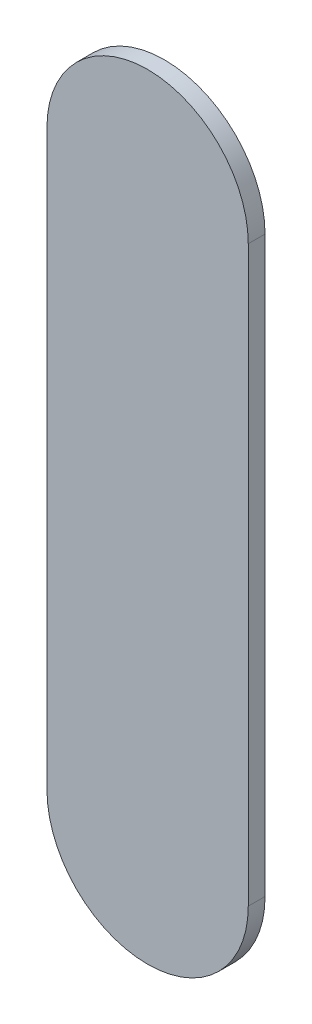
ISO-10303-21;
HEADER;
FILE_DESCRIPTION(('STEP AP214'),'2;1');
FILE_NAME('part.step','',(''),(''),'','','');
FILE_SCHEMA(('AUTOMOTIVE_DESIGN { 1 0 10303 214 1 1 1 1 }'));
ENDSEC;
DATA;
#1=APPLICATION_CONTEXT('core data for automotive mechanical design processes');
#2=APPLICATION_PROTOCOL_DEFINITION('international standard','automotive_design',2000,#1);
#3=PRODUCT_CONTEXT('',#1,'mechanical');
#4=PRODUCT('Part','Part','',(#3));
#5=PRODUCT_RELATED_PRODUCT_CATEGORY('part','',(#4));
#6=PRODUCT_DEFINITION_FORMATION('','',#4);
#7=PRODUCT_DEFINITION_CONTEXT('part definition',#1,'design');
#8=PRODUCT_DEFINITION('design','',#6,#7);
#9=PRODUCT_DEFINITION_SHAPE('','',#8);
#10=(LENGTH_UNIT() NAMED_UNIT(*) SI_UNIT(.MILLI.,.METRE.));
#11=(NAMED_UNIT(*) PLANE_ANGLE_UNIT() SI_UNIT($,.RADIAN.));
#12=(NAMED_UNIT(*) SI_UNIT($,.STERADIAN.) SOLID_ANGLE_UNIT());
#13=UNCERTAINTY_MEASURE_WITH_UNIT(LENGTH_MEASURE(1.E-05),#10,'distance_accuracy_value','');
#14=(GEOMETRIC_REPRESENTATION_CONTEXT(3) GLOBAL_UNCERTAINTY_ASSIGNED_CONTEXT((#13)) GLOBAL_UNIT_ASSIGNED_CONTEXT((#10,
#11,#12)) REPRESENTATION_CONTEXT('',''));
#15=CARTESIAN_POINT('',(0.,0.,0.));
#16=DIRECTION('',(0.,0.,1.));
#17=DIRECTION('',(1.,0.,0.));
#18=AXIS2_PLACEMENT_3D('',#15,#16,#17);
#19=CARTESIAN_POINT('',(45.106999511719,53.349848632812,1.1596000001));
#20=DIRECTION('',(0.,0.,1.));
#21=DIRECTION('',(1.,0.,0.));
#22=AXIS2_PLACEMENT_3D('',#19,#20,#21);
#23=PLANE('',#22);
#24=DIRECTION('',(0.,1.,0.));
#25=VECTOR('',#24,1.);
#26=CARTESIAN_POINT('',(45.03080078125,53.132700195312,1.1596000001));
#27=LINE('',#26,#25);
#28=CARTESIAN_POINT('',(45.03080078125,53.132697753906,1.1596000001));
#29=VERTEX_POINT('',#28);
#30=CARTESIAN_POINT('',(45.03080078125,53.566998291016,1.1596000001));
#31=VERTEX_POINT('',#30);
#32=EDGE_CURVE('E108',#29,#31,#27,.T.);
#33=ORIENTED_EDGE('',*,*,#32,.T.);
#34=CARTESIAN_POINT('',(45.106999511719,53.566999511719,1.1596000001));
#35=DIRECTION('',(0.,0.,1.));
#36=DIRECTION('',(1.,0.,0.));
#37=AXIS2_PLACEMENT_3D('',#34,#35,#36);
#38=CIRCLE('',#37,0.07619873050786);
#39=CARTESIAN_POINT('',(45.183198242207,53.566999511719,1.1596000001));
#40=VERTEX_POINT('',#39);
#41=EDGE_CURVE('E79',#40,#31,#38,.T.);
#42=ORIENTED_EDGE('',*,*,#41,.F.);
#43=DIRECTION('',(0.,-1.,0.));
#44=VECTOR('',#43,1.);
#45=CARTESIAN_POINT('',(45.183198242188,53.566997070312,1.1596000001));
#46=LINE('',#45,#44);
#47=CARTESIAN_POINT('',(45.183198242188,53.132698974609,1.1596000001));
#48=VERTEX_POINT('',#47);
#49=EDGE_CURVE('E27',#40,#48,#46,.T.);
#50=ORIENTED_EDGE('',*,*,#49,.T.);
#51=CARTESIAN_POINT('',(45.106999511719,53.132697753906,1.1596000001));
#52=DIRECTION('',(0.,0.,1.));
#53=DIRECTION('',(1.,0.,0.));
#54=AXIS2_PLACEMENT_3D('',#51,#52,#53);
#55=CIRCLE('',#54,0.07619873050786);
#56=EDGE_CURVE('E11',#29,#48,#55,.T.);
#57=ORIENTED_EDGE('',*,*,#56,.F.);
#58=EDGE_LOOP('',(#33,#42,#50,#57));
#59=FACE_BOUND('',#58,.T.);
#60=ADVANCED_FACE('F17',(#59),#23,.F.);
#61=CARTESIAN_POINT('',(45.106999511719,53.132697753906,1.1596000001));
#62=DIRECTION('',(0.,0.,1.));
#63=DIRECTION('',(1.,0.,0.));
#64=AXIS2_PLACEMENT_3D('',#61,#62,#63);
#65=CYLINDRICAL_SURFACE('',#64,0.07619873050786);
#66=DIRECTION('',(0.,0.,1.));
#67=VECTOR('',#66,1.);
#68=CARTESIAN_POINT('',(45.183198242188,53.132700195312,1.1596000001));
#69=LINE('',#68,#67);
#70=CARTESIAN_POINT('',(45.183198242188,53.132698974609,1.1723000001));
#71=VERTEX_POINT('',#70);
#72=EDGE_CURVE('E102',#48,#71,#69,.T.);
#73=ORIENTED_EDGE('',*,*,#72,.T.);
#74=CARTESIAN_POINT('',(45.106999511719,53.132697753906,1.1723000001));
#75=DIRECTION('',(0.,0.,1.));
#76=DIRECTION('',(1.,0.,0.));
#77=AXIS2_PLACEMENT_3D('',#74,#75,#76);
#78=CIRCLE('',#77,0.07619873050786);
#79=CARTESIAN_POINT('',(45.03080078125,53.132697753906,1.1723000001));
#80=VERTEX_POINT('',#79);
#81=EDGE_CURVE('E88',#80,#71,#78,.T.);
#82=ORIENTED_EDGE('',*,*,#81,.F.);
#83=DIRECTION('',(0.,0.,-1.));
#84=VECTOR('',#83,1.);
#85=CARTESIAN_POINT('',(45.03080078125,53.132697753906,1.1596000001));
#86=LINE('',#85,#84);
#87=EDGE_CURVE('E80',#80,#29,#86,.T.);
#88=ORIENTED_EDGE('',*,*,#87,.T.);
#89=ORIENTED_EDGE('',*,*,#56,.T.);
#90=EDGE_LOOP('',(#73,#82,#88,#89));
#91=FACE_BOUND('',#90,.T.);
#92=ADVANCED_FACE('F159',(#91),#65,.T.);
#93=CARTESIAN_POINT('',(45.183198242188,53.566997070312,1.1596000001));
#94=DIRECTION('',(-1.,0.,0.));
#95=DIRECTION('',(0.,0.,1.));
#96=AXIS2_PLACEMENT_3D('',#93,#94,#95);
#97=PLANE('',#96);
#98=ORIENTED_EDGE('',*,*,#72,.F.);
#99=ORIENTED_EDGE('',*,*,#49,.F.);
#100=DIRECTION('',(0.,0.,-1.));
#101=VECTOR('',#100,1.);
#102=CARTESIAN_POINT('',(45.183198242227,53.566999511719,1.1596000001));
#103=LINE('',#102,#101);
#104=CARTESIAN_POINT('',(45.183198242207,53.566999511719,1.1723000001));
#105=VERTEX_POINT('',#104);
#106=EDGE_CURVE('E71',#105,#40,#103,.T.);
#107=ORIENTED_EDGE('',*,*,#106,.F.);
#108=DIRECTION('',(0.,1.,0.));
#109=VECTOR('',#108,1.);
#110=CARTESIAN_POINT('',(45.183198242188,53.349848632812,1.1723000001));
#111=LINE('',#110,#109);
#112=EDGE_CURVE('E74',#71,#105,#111,.T.);
#113=ORIENTED_EDGE('',*,*,#112,.F.);
#114=EDGE_LOOP('',(#98,#99,#107,#113));
#115=FACE_BOUND('',#114,.T.);
#116=ADVANCED_FACE('F73',(#115),#97,.F.);
#117=CARTESIAN_POINT('',(45.106999511719,53.566999511719,1.1596000001));
#118=DIRECTION('',(0.,0.,1.));
#119=DIRECTION('',(1.,0.,0.));
#120=AXIS2_PLACEMENT_3D('',#117,#118,#119);
#121=CYLINDRICAL_SURFACE('',#120,0.07619873050786);
#122=DIRECTION('',(0.,0.,1.));
#123=VECTOR('',#122,1.);
#124=CARTESIAN_POINT('',(45.03080078125,53.566997070312,1.1596000001));
#125=LINE('',#124,#123);
#126=CARTESIAN_POINT('',(45.03080078125,53.566998291016,1.1723000001));
#127=VERTEX_POINT('',#126);
#128=EDGE_CURVE('E21',#31,#127,#125,.T.);
#129=ORIENTED_EDGE('',*,*,#128,.T.);
#130=CARTESIAN_POINT('',(45.106999511719,53.566999511719,1.1723000001));
#131=DIRECTION('',(0.,0.,1.));
#132=DIRECTION('',(1.,0.,0.));
#133=AXIS2_PLACEMENT_3D('',#130,#131,#132);
#134=CIRCLE('',#133,0.07619873050786);
#135=EDGE_CURVE('E86',#105,#127,#134,.T.);
#136=ORIENTED_EDGE('',*,*,#135,.F.);
#137=ORIENTED_EDGE('',*,*,#106,.T.);
#138=ORIENTED_EDGE('',*,*,#41,.T.);
#139=EDGE_LOOP('',(#129,#136,#137,#138));
#140=FACE_BOUND('',#139,.T.);
#141=ADVANCED_FACE('F19',(#140),#121,.T.);
#142=CARTESIAN_POINT('',(45.03080078125,53.132700195312,1.1596000001));
#143=DIRECTION('',(1.,0.,0.));
#144=DIRECTION('',(0.,1.,0.));
#145=AXIS2_PLACEMENT_3D('',#142,#143,#144);
#146=PLANE('',#145);
#147=ORIENTED_EDGE('',*,*,#128,.F.);
#148=ORIENTED_EDGE('',*,*,#32,.F.);
#149=ORIENTED_EDGE('',*,*,#87,.F.);
#150=DIRECTION('',(0.,-1.,0.));
#151=VECTOR('',#150,1.);
#152=CARTESIAN_POINT('',(45.03080078125,53.349848632812,1.1723000001));
#153=LINE('',#152,#151);
#154=EDGE_CURVE('E94',#127,#80,#153,.T.);
#155=ORIENTED_EDGE('',*,*,#154,.F.);
#156=EDGE_LOOP('',(#147,#148,#149,#155));
#157=FACE_BOUND('',#156,.T.);
#158=ADVANCED_FACE('F175',(#157),#146,.F.);
#159=CARTESIAN_POINT('',(45.106999511719,53.349848632812,1.1723000001));
#160=DIRECTION('',(0.,0.,1.));
#161=DIRECTION('',(1.,0.,0.));
#162=AXIS2_PLACEMENT_3D('',#159,#160,#161);
#163=PLANE('',#162);
#164=ORIENTED_EDGE('',*,*,#135,.T.);
#165=ORIENTED_EDGE('',*,*,#154,.T.);
#166=ORIENTED_EDGE('',*,*,#81,.T.);
#167=ORIENTED_EDGE('',*,*,#112,.T.);
#168=EDGE_LOOP('',(#164,#165,#166,#167));
#169=FACE_BOUND('',#168,.T.);
#170=ADVANCED_FACE('F84',(#169),#163,.T.);
#171=CLOSED_SHELL('',(#60,#92,#116,#141,#158,#170));
#172=MANIFOLD_SOLID_BREP('B1',#171);
#173=ADVANCED_BREP_SHAPE_REPRESENTATION('',(#18,#172),#14);
#174=SHAPE_DEFINITION_REPRESENTATION(#9,#173);
ENDSEC;
END-ISO-10303-21;
